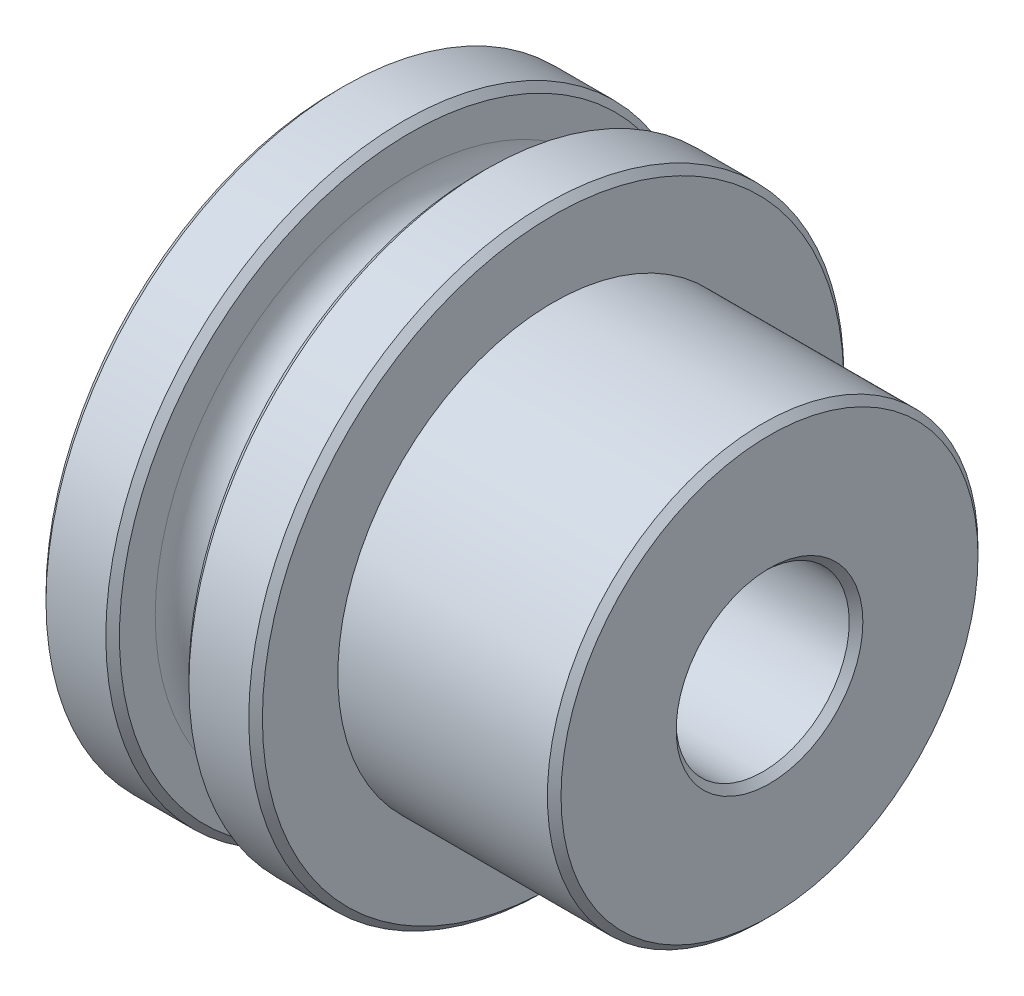
ISO-10303-21;
HEADER;
FILE_DESCRIPTION(('STEP AP214'),'2;1');
FILE_NAME('part.step','',(''),(''),'','','');
FILE_SCHEMA(('AUTOMOTIVE_DESIGN { 1 0 10303 214 1 1 1 1 }'));
ENDSEC;
DATA;
#1=APPLICATION_CONTEXT('core data for automotive mechanical design processes');
#2=APPLICATION_PROTOCOL_DEFINITION('international standard','automotive_design',2000,#1);
#3=PRODUCT_CONTEXT('',#1,'mechanical');
#4=PRODUCT('Part','Part','',(#3));
#5=PRODUCT_RELATED_PRODUCT_CATEGORY('part','',(#4));
#6=PRODUCT_DEFINITION_FORMATION('','',#4);
#7=PRODUCT_DEFINITION_CONTEXT('part definition',#1,'design');
#8=PRODUCT_DEFINITION('design','',#6,#7);
#9=PRODUCT_DEFINITION_SHAPE('','',#8);
#10=(LENGTH_UNIT() NAMED_UNIT(*) SI_UNIT(.MILLI.,.METRE.));
#11=(NAMED_UNIT(*) PLANE_ANGLE_UNIT() SI_UNIT($,.RADIAN.));
#12=(NAMED_UNIT(*) SI_UNIT($,.STERADIAN.) SOLID_ANGLE_UNIT());
#13=UNCERTAINTY_MEASURE_WITH_UNIT(LENGTH_MEASURE(1.E-05),#10,'distance_accuracy_value','');
#14=(GEOMETRIC_REPRESENTATION_CONTEXT(3) GLOBAL_UNCERTAINTY_ASSIGNED_CONTEXT((#13)) GLOBAL_UNIT_ASSIGNED_CONTEXT((#10,
#11,#12)) REPRESENTATION_CONTEXT('',''));
#15=CARTESIAN_POINT('',(0.,0.,0.));
#16=DIRECTION('',(0.,0.,1.));
#17=DIRECTION('',(1.,0.,0.));
#18=AXIS2_PLACEMENT_3D('',#15,#16,#17);
#19=CARTESIAN_POINT('',(-12.7,0.,0.));
#20=DIRECTION('',(1.,0.,0.));
#21=DIRECTION('',(0.,0.,-1.));
#22=AXIS2_PLACEMENT_3D('',#19,#20,#21);
#23=CYLINDRICAL_SURFACE('',#22,17.4625);
#24=CARTESIAN_POINT('',(-8.78999998400001,0.,0.));
#25=DIRECTION('',(1.,0.,0.));
#26=DIRECTION('',(0.,0.,-1.));
#27=AXIS2_PLACEMENT_3D('',#24,#25,#26);
#28=CIRCLE('',#27,17.4625);
#29=CARTESIAN_POINT('',(-8.78999998400001,0.,-17.4625));
#30=VERTEX_POINT('',#29);
#31=EDGE_CURVE('E75',#30,#30,#28,.F.);
#32=ORIENTED_EDGE('',*,*,#31,.T.);
#33=EDGE_LOOP('',(#32));
#34=FACE_BOUND('',#33,.T.);
#35=CARTESIAN_POINT('',(-12.3,0.,0.));
#36=DIRECTION('',(-1.,0.,0.));
#37=DIRECTION('',(0.,0.,1.));
#38=AXIS2_PLACEMENT_3D('',#35,#36,#37);
#39=CIRCLE('',#38,17.4625);
#40=CARTESIAN_POINT('',(-12.3,0.,17.4625));
#41=VERTEX_POINT('',#40);
#42=EDGE_CURVE('E78',#41,#41,#39,.F.);
#43=ORIENTED_EDGE('',*,*,#42,.T.);
#44=EDGE_LOOP('',(#43));
#45=FACE_BOUND('',#44,.T.);
#46=ADVANCED_FACE('F39',(#34,#45),#23,.T.);
#47=CARTESIAN_POINT('',(12.7,0.,0.));
#48=DIRECTION('',(-1.,0.,0.));
#49=DIRECTION('',(0.,0.,1.));
#50=AXIS2_PLACEMENT_3D('',#47,#48,#49);
#51=CYLINDRICAL_SURFACE('',#50,12.6365);
#52=CARTESIAN_POINT('',(12.3,0.,0.));
#53=DIRECTION('',(1.,0.,0.));
#54=DIRECTION('',(0.,0.,-1.));
#55=AXIS2_PLACEMENT_3D('',#52,#53,#54);
#56=CIRCLE('',#55,12.6365);
#57=CARTESIAN_POINT('',(12.3,0.,-12.6365));
#58=VERTEX_POINT('',#57);
#59=EDGE_CURVE('E47',#58,#58,#56,.F.);
#60=ORIENTED_EDGE('',*,*,#59,.T.);
#61=EDGE_LOOP('',(#60));
#62=FACE_BOUND('',#61,.T.);
#63=CARTESIAN_POINT('',(0.,0.,0.));
#64=DIRECTION('',(1.,0.,0.));
#65=DIRECTION('',(0.,0.,-1.));
#66=AXIS2_PLACEMENT_3D('',#63,#64,#65);
#67=CIRCLE('',#66,12.6365);
#68=CARTESIAN_POINT('',(0.,0.,-12.6365));
#69=VERTEX_POINT('',#68);
#70=EDGE_CURVE('E90',#69,#69,#67,.T.);
#71=ORIENTED_EDGE('',*,*,#70,.T.);
#72=EDGE_LOOP('',(#71));
#73=FACE_BOUND('',#72,.T.);
#74=ADVANCED_FACE('F130',(#62,#73),#51,.T.);
#75=CARTESIAN_POINT('',(12.7,0.,0.));
#76=DIRECTION('',(1.,0.,0.));
#77=DIRECTION('',(0.,0.,-1.));
#78=AXIS2_PLACEMENT_3D('',#75,#76,#77);
#79=PLANE('',#78);
#80=CARTESIAN_POINT('',(12.7,0.,0.));
#81=DIRECTION('',(1.,0.,0.));
#82=DIRECTION('',(0.,0.,-1.));
#83=AXIS2_PLACEMENT_3D('',#80,#81,#82);
#84=CIRCLE('',#83,12.2365);
#85=CARTESIAN_POINT('',(12.7,0.,-12.2365));
#86=VERTEX_POINT('',#85);
#87=EDGE_CURVE('E51',#86,#86,#84,.T.);
#88=ORIENTED_EDGE('',*,*,#87,.T.);
#89=EDGE_LOOP('',(#88));
#90=FACE_BOUND('',#89,.T.);
#91=CARTESIAN_POINT('',(12.7,0.,0.));
#92=DIRECTION('',(1.,0.,0.));
#93=DIRECTION('',(0.,0.,-1.));
#94=AXIS2_PLACEMENT_3D('',#91,#92,#93);
#95=CIRCLE('',#94,5.48000000000001);
#96=CARTESIAN_POINT('',(12.7,0.,-5.48000000000001));
#97=VERTEX_POINT('',#96);
#98=EDGE_CURVE('E55',#97,#97,#95,.F.);
#99=ORIENTED_EDGE('',*,*,#98,.T.);
#100=EDGE_LOOP('',(#99));
#101=FACE_BOUND('',#100,.T.);
#102=ADVANCED_FACE('F137',(#90,#101),#79,.T.);
#103=CARTESIAN_POINT('',(-0.399999999999998,0.,0.));
#104=DIRECTION('',(-1.,0.,0.));
#105=DIRECTION('',(0.,0.,1.));
#106=AXIS2_PLACEMENT_3D('',#103,#104,#105);
#107=CIRCLE('',#106,17.4625);
#108=CARTESIAN_POINT('',(-0.399999999999998,0.,17.4625));
#109=VERTEX_POINT('',#108);
#110=EDGE_CURVE('E66',#109,#109,#107,.T.);
#111=ORIENTED_EDGE('',*,*,#110,.T.);
#112=EDGE_LOOP('',(#111));
#113=FACE_BOUND('',#112,.T.);
#114=CARTESIAN_POINT('',(-3.91000001600001,0.,0.));
#115=DIRECTION('',(1.,0.,0.));
#116=DIRECTION('',(0.,0.,-1.));
#117=AXIS2_PLACEMENT_3D('',#114,#115,#116);
#118=CIRCLE('',#117,17.4625);
#119=CARTESIAN_POINT('',(-3.91000001600001,0.,-17.4625));
#120=VERTEX_POINT('',#119);
#121=EDGE_CURVE('E69',#120,#120,#118,.T.);
#122=ORIENTED_EDGE('',*,*,#121,.T.);
#123=EDGE_LOOP('',(#122));
#124=FACE_BOUND('',#123,.T.);
#125=ADVANCED_FACE('F133',(#113,#124),#23,.T.);
#126=CARTESIAN_POINT('',(-12.7,0.,0.));
#127=DIRECTION('',(-1.,0.,0.));
#128=DIRECTION('',(0.,0.,1.));
#129=AXIS2_PLACEMENT_3D('',#126,#127,#128);
#130=PLANE('',#129);
#131=CARTESIAN_POINT('',(-12.7,0.,0.));
#132=DIRECTION('',(-1.,0.,0.));
#133=DIRECTION('',(0.,0.,1.));
#134=AXIS2_PLACEMENT_3D('',#131,#132,#133);
#135=CIRCLE('',#134,11.5125);
#136=CARTESIAN_POINT('',(-12.7,0.,11.5125));
#137=VERTEX_POINT('',#136);
#138=EDGE_CURVE('E81',#137,#137,#135,.F.);
#139=ORIENTED_EDGE('',*,*,#138,.T.);
#140=EDGE_LOOP('',(#139));
#141=FACE_BOUND('',#140,.T.);
#142=CARTESIAN_POINT('',(-12.7,0.,0.));
#143=DIRECTION('',(-1.,0.,0.));
#144=DIRECTION('',(0.,0.,1.));
#145=AXIS2_PLACEMENT_3D('',#142,#143,#144);
#146=CIRCLE('',#145,17.0625);
#147=CARTESIAN_POINT('',(-12.7,0.,17.0625));
#148=VERTEX_POINT('',#147);
#149=EDGE_CURVE('E84',#148,#148,#146,.T.);
#150=ORIENTED_EDGE('',*,*,#149,.T.);
#151=EDGE_LOOP('',(#150));
#152=FACE_BOUND('',#151,.T.);
#153=ADVANCED_FACE('F143',(#141,#152),#130,.T.);
#154=CARTESIAN_POINT('',(0.,0.,0.));
#155=DIRECTION('',(-1.,0.,0.));
#156=DIRECTION('',(0.,0.,1.));
#157=AXIS2_PLACEMENT_3D('',#154,#155,#156);
#158=PLANE('',#157);
#159=CARTESIAN_POINT('',(0.,0.,0.));
#160=DIRECTION('',(-1.,0.,0.));
#161=DIRECTION('',(0.,0.,1.));
#162=AXIS2_PLACEMENT_3D('',#159,#160,#161);
#163=CIRCLE('',#162,17.0625);
#164=CARTESIAN_POINT('',(0.,0.,17.0625));
#165=VERTEX_POINT('',#164);
#166=EDGE_CURVE('E63',#165,#165,#163,.F.);
#167=ORIENTED_EDGE('',*,*,#166,.T.);
#168=EDGE_LOOP('',(#167));
#169=FACE_BOUND('',#168,.T.);
#170=ORIENTED_EDGE('',*,*,#70,.F.);
#171=EDGE_LOOP('',(#170));
#172=FACE_BOUND('',#171,.T.);
#173=ADVANCED_FACE('F149',(#169,#172),#158,.F.);
#174=CARTESIAN_POINT('',(-5.588,0.,0.));
#175=DIRECTION('',(-1.,0.,0.));
#176=DIRECTION('',(0.,0.,1.));
#177=AXIS2_PLACEMENT_3D('',#174,#175,#176);
#178=CYLINDRICAL_SURFACE('',#177,11.1125);
#179=CARTESIAN_POINT('',(-12.3,0.,0.));
#180=DIRECTION('',(-1.,0.,0.));
#181=DIRECTION('',(0.,0.,1.));
#182=AXIS2_PLACEMENT_3D('',#179,#180,#181);
#183=CIRCLE('',#182,11.1125);
#184=CARTESIAN_POINT('',(-12.3,0.,11.1125));
#185=VERTEX_POINT('',#184);
#186=EDGE_CURVE('E87',#185,#185,#183,.T.);
#187=ORIENTED_EDGE('',*,*,#186,.T.);
#188=EDGE_LOOP('',(#187));
#189=FACE_BOUND('',#188,.T.);
#190=CARTESIAN_POINT('',(-5.588,0.,0.));
#191=DIRECTION('',(-1.,0.,0.));
#192=DIRECTION('',(0.,0.,1.));
#193=AXIS2_PLACEMENT_3D('',#190,#191,#192);
#194=CIRCLE('',#193,11.1125);
#195=CARTESIAN_POINT('',(-5.588,0.,11.1125));
#196=VERTEX_POINT('',#195);
#197=EDGE_CURVE('E93',#196,#196,#194,.T.);
#198=ORIENTED_EDGE('',*,*,#197,.F.);
#199=EDGE_LOOP('',(#198));
#200=FACE_BOUND('',#199,.T.);
#201=ADVANCED_FACE('F225',(#189,#200),#178,.F.);
#202=CARTESIAN_POINT('',(-5.588,0.,0.));
#203=DIRECTION('',(-1.,0.,0.));
#204=DIRECTION('',(0.,0.,1.));
#205=AXIS2_PLACEMENT_3D('',#202,#203,#204);
#206=PLANE('',#205);
#207=CARTESIAN_POINT('',(-5.588,0.,0.));
#208=DIRECTION('',(-1.,0.,0.));
#209=DIRECTION('',(0.,0.,1.));
#210=AXIS2_PLACEMENT_3D('',#207,#208,#209);
#211=CIRCLE('',#210,7.27458794);
#212=CARTESIAN_POINT('',(-5.588,0.,7.27458794));
#213=VERTEX_POINT('',#212);
#214=EDGE_CURVE('E97',#213,#213,#211,.T.);
#215=ORIENTED_EDGE('',*,*,#214,.F.);
#216=EDGE_LOOP('',(#215));
#217=FACE_BOUND('',#216,.T.);
#218=ORIENTED_EDGE('',*,*,#197,.T.);
#219=EDGE_LOOP('',(#218));
#220=FACE_BOUND('',#219,.T.);
#221=ADVANCED_FACE('F221',(#217,#220),#206,.T.);
#222=CARTESIAN_POINT('',(-5.388,0.,0.));
#223=DIRECTION('',(-1.,0.,0.));
#224=DIRECTION('',(0.,0.,1.));
#225=AXIS2_PLACEMENT_3D('',#222,#223,#224);
#226=CYLINDRICAL_SURFACE('',#225,7.27458794);
#227=CARTESIAN_POINT('',(-5.388,0.,0.));
#228=DIRECTION('',(-1.,0.,0.));
#229=DIRECTION('',(0.,0.,1.));
#230=AXIS2_PLACEMENT_3D('',#227,#228,#229);
#231=CIRCLE('',#230,7.27458794);
#232=CARTESIAN_POINT('',(-5.388,0.,7.27458794));
#233=VERTEX_POINT('',#232);
#234=EDGE_CURVE('E96',#233,#233,#231,.T.);
#235=ORIENTED_EDGE('',*,*,#234,.F.);
#236=EDGE_LOOP('',(#235));
#237=FACE_BOUND('',#236,.T.);
#238=ORIENTED_EDGE('',*,*,#214,.T.);
#239=EDGE_LOOP('',(#238));
#240=FACE_BOUND('',#239,.T.);
#241=ADVANCED_FACE('F217',(#237,#240),#226,.F.);
#242=CARTESIAN_POINT('',(-5.388,0.,0.));
#243=DIRECTION('',(-1.,0.,0.));
#244=DIRECTION('',(0.,0.,1.));
#245=AXIS2_PLACEMENT_3D('',#242,#243,#244);
#246=PLANE('',#245);
#247=CARTESIAN_POINT('',(-5.388,0.,0.));
#248=DIRECTION('',(-1.,0.,0.));
#249=DIRECTION('',(0.,0.,1.));
#250=AXIS2_PLACEMENT_3D('',#247,#248,#249);
#251=CIRCLE('',#250,5.08);
#252=CARTESIAN_POINT('',(-5.388,0.,5.08));
#253=VERTEX_POINT('',#252);
#254=EDGE_CURVE('E100',#253,#253,#251,.T.);
#255=ORIENTED_EDGE('',*,*,#254,.F.);
#256=EDGE_LOOP('',(#255));
#257=FACE_BOUND('',#256,.T.);
#258=ORIENTED_EDGE('',*,*,#234,.T.);
#259=EDGE_LOOP('',(#258));
#260=FACE_BOUND('',#259,.T.);
#261=ADVANCED_FACE('F212',(#257,#260),#246,.T.);
#262=CARTESIAN_POINT('',(12.7,0.,0.));
#263=DIRECTION('',(-1.,0.,0.));
#264=DIRECTION('',(0.,0.,1.));
#265=AXIS2_PLACEMENT_3D('',#262,#263,#264);
#266=CYLINDRICAL_SURFACE('',#265,5.08);
#267=CARTESIAN_POINT('',(12.3,0.,0.));
#268=DIRECTION('',(1.,0.,0.));
#269=DIRECTION('',(0.,0.,-1.));
#270=AXIS2_PLACEMENT_3D('',#267,#268,#269);
#271=CIRCLE('',#270,5.08);
#272=CARTESIAN_POINT('',(12.3,0.,-5.08));
#273=VERTEX_POINT('',#272);
#274=EDGE_CURVE('E10',#273,#273,#271,.T.);
#275=ORIENTED_EDGE('',*,*,#274,.T.);
#276=EDGE_LOOP('',(#275));
#277=FACE_BOUND('',#276,.T.);
#278=ORIENTED_EDGE('',*,*,#254,.T.);
#279=EDGE_LOOP('',(#278));
#280=FACE_BOUND('',#279,.T.);
#281=ADVANCED_FACE('F206',(#277,#280),#266,.F.);
#282=CARTESIAN_POINT('',(-8.389999984,0.,0.));
#283=DIRECTION('',(1.,0.,0.));
#284=DIRECTION('',(0.,0.,-1.));
#285=AXIS2_PLACEMENT_3D('',#282,#283,#284);
#286=PLANE('',#285);
#287=CARTESIAN_POINT('',(-8.389999984,0.,0.));
#288=DIRECTION('',(1.,0.,0.));
#289=DIRECTION('',(0.,0.,-1.));
#290=AXIS2_PLACEMENT_3D('',#287,#288,#289);
#291=CIRCLE('',#290,17.0625);
#292=CARTESIAN_POINT('',(-8.389999984,0.,-17.0625));
#293=VERTEX_POINT('',#292);
#294=EDGE_CURVE('E72',#293,#293,#291,.T.);
#295=ORIENTED_EDGE('',*,*,#294,.T.);
#296=EDGE_LOOP('',(#295));
#297=FACE_BOUND('',#296,.T.);
#298=CARTESIAN_POINT('',(-8.389999984,0.,0.));
#299=DIRECTION('',(-1.,0.,0.));
#300=DIRECTION('',(0.,0.,1.));
#301=AXIS2_PLACEMENT_3D('',#298,#299,#300);
#302=CIRCLE('',#301,14.96249992);
#303=CARTESIAN_POINT('',(-8.389999984,0.,14.96249992));
#304=VERTEX_POINT('',#303);
#305=EDGE_CURVE('E105',#304,#304,#302,.T.);
#306=ORIENTED_EDGE('',*,*,#305,.T.);
#307=EDGE_LOOP('',(#306));
#308=FACE_BOUND('',#307,.T.);
#309=ADVANCED_FACE('F127',(#297,#308),#286,.T.);
#310=CARTESIAN_POINT('',(-6.35,0.,0.));
#311=DIRECTION('',(-1.,0.,0.));
#312=DIRECTION('',(0.,0.,1.));
#313=AXIS2_PLACEMENT_3D('',#310,#311,#312);
#314=TOROIDAL_SURFACE('',#313,14.96249992,2.039999984);
#315=CARTESIAN_POINT('',(-4.310000016,0.,0.));
#316=DIRECTION('',(-1.,0.,0.));
#317=DIRECTION('',(0.,0.,1.));
#318=AXIS2_PLACEMENT_3D('',#315,#316,#317);
#319=CIRCLE('',#318,14.96249992);
#320=CARTESIAN_POINT('',(-4.310000016,0.,14.96249992));
#321=VERTEX_POINT('',#320);
#322=EDGE_CURVE('E108',#321,#321,#319,.T.);
#323=ORIENTED_EDGE('',*,*,#322,.T.);
#324=EDGE_LOOP('',(#323));
#325=FACE_BOUND('',#324,.T.);
#326=ORIENTED_EDGE('',*,*,#305,.F.);
#327=EDGE_LOOP('',(#326));
#328=FACE_BOUND('',#327,.T.);
#329=ADVANCED_FACE('F112',(#325,#328),#314,.F.);
#330=CARTESIAN_POINT('',(-4.310000016,0.,0.));
#331=DIRECTION('',(1.,0.,0.));
#332=DIRECTION('',(0.,0.,-1.));
#333=AXIS2_PLACEMENT_3D('',#330,#331,#332);
#334=PLANE('',#333);
#335=CARTESIAN_POINT('',(-4.310000016,0.,0.));
#336=DIRECTION('',(1.,0.,0.));
#337=DIRECTION('',(0.,0.,-1.));
#338=AXIS2_PLACEMENT_3D('',#335,#336,#337);
#339=CIRCLE('',#338,17.0625);
#340=CARTESIAN_POINT('',(-4.310000016,0.,-17.0625));
#341=VERTEX_POINT('',#340);
#342=EDGE_CURVE('E60',#341,#341,#339,.F.);
#343=ORIENTED_EDGE('',*,*,#342,.T.);
#344=EDGE_LOOP('',(#343));
#345=FACE_BOUND('',#344,.T.);
#346=ORIENTED_EDGE('',*,*,#322,.F.);
#347=EDGE_LOOP('',(#346));
#348=FACE_BOUND('',#347,.T.);
#349=ADVANCED_FACE('F115',(#345,#348),#334,.F.);
#350=CARTESIAN_POINT('',(-12.3,0.,0.));
#351=DIRECTION('',(-1.,0.,0.));
#352=DIRECTION('',(0.,0.,1.));
#353=AXIS2_PLACEMENT_3D('',#350,#351,#352);
#354=CONICAL_SURFACE('',#353,11.1125,0.785398163397453);
#355=CARTESIAN_POINT('',(-12.7,0.,11.5125));
#356=CARTESIAN_POINT('',(-12.6958333333333,0.,11.5083333333333));
#357=CARTESIAN_POINT('',(-12.6916666666667,0.,11.5041666666667));
#358=CARTESIAN_POINT('',(-12.6833333333333,0.,11.4958333333333));
#359=CARTESIAN_POINT('',(-12.6791666666667,0.,11.4916666666667));
#360=CARTESIAN_POINT('',(-12.6708333333333,0.,11.4833333333333));
#361=CARTESIAN_POINT('',(-12.6666666666667,0.,11.4791666666667));
#362=CARTESIAN_POINT('',(-12.6583333333333,0.,11.4708333333333));
#363=CARTESIAN_POINT('',(-12.6541666666667,0.,11.4666666666667));
#364=CARTESIAN_POINT('',(-12.6458333333333,0.,11.4583333333333));
#365=CARTESIAN_POINT('',(-12.6416666666667,0.,11.4541666666667));
#366=CARTESIAN_POINT('',(-12.6333333333333,0.,11.4458333333333));
#367=CARTESIAN_POINT('',(-12.6291666666667,0.,11.4416666666667));
#368=CARTESIAN_POINT('',(-12.6208333333333,0.,11.4333333333333));
#369=CARTESIAN_POINT('',(-12.6166666666667,0.,11.4291666666667));
#370=CARTESIAN_POINT('',(-12.6083333333333,0.,11.4208333333333));
#371=CARTESIAN_POINT('',(-12.6041666666667,0.,11.4166666666667));
#372=CARTESIAN_POINT('',(-12.5958333333333,0.,11.4083333333333));
#373=CARTESIAN_POINT('',(-12.5916666666667,0.,11.4041666666667));
#374=CARTESIAN_POINT('',(-12.5833333333333,0.,11.3958333333333));
#375=CARTESIAN_POINT('',(-12.5791666666667,0.,11.3916666666667));
#376=CARTESIAN_POINT('',(-12.5708333333333,0.,11.3833333333333));
#377=CARTESIAN_POINT('',(-12.5666666666667,0.,11.3791666666667));
#378=CARTESIAN_POINT('',(-12.5583333333333,0.,11.3708333333333));
#379=CARTESIAN_POINT('',(-12.5541666666667,0.,11.3666666666667));
#380=CARTESIAN_POINT('',(-12.5458333333333,0.,11.3583333333333));
#381=CARTESIAN_POINT('',(-12.5416666666667,0.,11.3541666666667));
#382=CARTESIAN_POINT('',(-12.5333333333333,0.,11.3458333333333));
#383=CARTESIAN_POINT('',(-12.5291666666667,0.,11.3416666666667));
#384=CARTESIAN_POINT('',(-12.5208333333333,0.,11.3333333333333));
#385=CARTESIAN_POINT('',(-12.5166666666667,0.,11.3291666666667));
#386=CARTESIAN_POINT('',(-12.5083333333333,0.,11.3208333333333));
#387=CARTESIAN_POINT('',(-12.5041666666667,0.,11.3166666666667));
#388=CARTESIAN_POINT('',(-12.4958333333333,0.,11.3083333333333));
#389=CARTESIAN_POINT('',(-12.4916666666667,0.,11.3041666666667));
#390=CARTESIAN_POINT('',(-12.4833333333333,0.,11.2958333333333));
#391=CARTESIAN_POINT('',(-12.4791666666667,0.,11.2916666666667));
#392=CARTESIAN_POINT('',(-12.4708333333333,0.,11.2833333333333));
#393=CARTESIAN_POINT('',(-12.4666666666667,0.,11.2791666666667));
#394=CARTESIAN_POINT('',(-12.4583333333333,0.,11.2708333333333));
#395=CARTESIAN_POINT('',(-12.4541666666667,0.,11.2666666666667));
#396=CARTESIAN_POINT('',(-12.4458333333333,0.,11.2583333333333));
#397=CARTESIAN_POINT('',(-12.4416666666667,0.,11.2541666666667));
#398=CARTESIAN_POINT('',(-12.4333333333333,0.,11.2458333333333));
#399=CARTESIAN_POINT('',(-12.4291666666667,0.,11.2416666666667));
#400=CARTESIAN_POINT('',(-12.4208333333333,0.,11.2333333333333));
#401=CARTESIAN_POINT('',(-12.4166666666667,0.,11.2291666666667));
#402=CARTESIAN_POINT('',(-12.4083333333333,0.,11.2208333333333));
#403=CARTESIAN_POINT('',(-12.4041666666667,0.,11.2166666666667));
#404=CARTESIAN_POINT('',(-12.3958333333333,0.,11.2083333333333));
#405=CARTESIAN_POINT('',(-12.3916666666667,0.,11.2041666666667));
#406=CARTESIAN_POINT('',(-12.3833333333333,0.,11.1958333333333));
#407=CARTESIAN_POINT('',(-12.3791666666667,0.,11.1916666666667));
#408=CARTESIAN_POINT('',(-12.3708333333333,0.,11.1833333333333));
#409=CARTESIAN_POINT('',(-12.3666666666667,0.,11.1791666666667));
#410=CARTESIAN_POINT('',(-12.3583333333333,0.,11.1708333333333));
#411=CARTESIAN_POINT('',(-12.3541666666667,0.,11.1666666666667));
#412=CARTESIAN_POINT('',(-12.3458333333333,0.,11.1583333333333));
#413=CARTESIAN_POINT('',(-12.3416666666667,0.,11.1541666666667));
#414=CARTESIAN_POINT('',(-12.3333333333333,0.,11.1458333333333));
#415=CARTESIAN_POINT('',(-12.3291666666667,0.,11.1416666666667));
#416=CARTESIAN_POINT('',(-12.3208333333333,0.,11.1333333333333));
#417=CARTESIAN_POINT('',(-12.3166666666667,0.,11.1291666666667));
#418=CARTESIAN_POINT('',(-12.3083333333333,0.,11.1208333333333));
#419=CARTESIAN_POINT('',(-12.3041666666667,0.,11.1166666666667));
#420=CARTESIAN_POINT('',(-12.3,0.,11.1125));
#421=B_SPLINE_CURVE_WITH_KNOTS('',3,(#355,#356,#357,#358,#359,#360,#361,#362,#363,#364,#365,
#366,#367,#368,#369,#370,#371,#372,#373,#374,#375,#376,#377,#378,#379,#380,#381,#382,#383,#384,
#385,#386,#387,#388,#389,#390,#391,#392,#393,#394,#395,#396,#397,#398,#399,#400,#401,#402,#403,
#404,#405,#406,#407,#408,#409,#410,#411,#412,#413,#414,#415,#416,#417,#418,#419,#420),
.UNSPECIFIED.,.F.,.F.,(4,2,2,2,2,2,2,2,2,2,2,2,2,2,2,2,2,2,2,2,2,2,2,2,2,2,2,2,2,2,2,2,4),(0.,
0.017677669529663,0.0353553390593272,0.0530330085889914,0.0707106781186556,0.0883883476483185,
0.106066017177983,0.123743686707646,0.14142135623731,0.159099025766974,0.176776695296637,
0.194454364826301,0.212132034355965,0.229809703885628,0.247487373415291,0.265165042944956,
0.28284271247462,0.300520382004284,0.318198051533948,0.335875721063611,0.353553390593274,
0.371231060122938,0.388908729652602,0.406586399182265,0.42426406871193,0.441941738241594,
0.459619407771257,0.477297077300921,0.494974746830584,0.512652416360248,0.530330085889912,
0.548007755419576,0.565685424949239),.UNSPECIFIED.);
#422=EDGE_CURVE('BSEAM117',#137,#185,#421,.T.);
#423=ORIENTED_EDGE('',*,*,#138,.F.);
#424=ORIENTED_EDGE('',*,*,#186,.F.);
#425=ORIENTED_EDGE('',*,*,#422,.T.);
#426=ORIENTED_EDGE('',*,*,#422,.F.);
#427=EDGE_LOOP('',(#423,#425,#424,#426));
#428=FACE_BOUND('',#427,.T.);
#429=ADVANCED_FACE('F117',(#428),#354,.F.);
#430=CARTESIAN_POINT('',(-8.78999998400001,0.,0.));
#431=DIRECTION('',(-1.,0.,0.));
#432=DIRECTION('',(0.,0.,1.));
#433=AXIS2_PLACEMENT_3D('',#430,#431,#432);
#434=CONICAL_SURFACE('',#433,17.4625,0.785398163397453);
#435=ORIENTED_EDGE('',*,*,#294,.F.);
#436=EDGE_LOOP('',(#435));
#437=FACE_BOUND('',#436,.T.);
#438=ORIENTED_EDGE('',*,*,#31,.F.);
#439=EDGE_LOOP('',(#438));
#440=FACE_BOUND('',#439,.T.);
#441=ADVANCED_FACE('F124',(#437,#440),#434,.T.);
#442=CARTESIAN_POINT('',(-12.7,0.,0.));
#443=DIRECTION('',(1.,0.,0.));
#444=DIRECTION('',(0.,0.,-1.));
#445=AXIS2_PLACEMENT_3D('',#442,#443,#444);
#446=CONICAL_SURFACE('',#445,17.0625,0.785398163397457);
#447=ORIENTED_EDGE('',*,*,#42,.F.);
#448=EDGE_LOOP('',(#447));
#449=FACE_BOUND('',#448,.T.);
#450=ORIENTED_EDGE('',*,*,#149,.F.);
#451=EDGE_LOOP('',(#450));
#452=FACE_BOUND('',#451,.T.);
#453=ADVANCED_FACE('F169',(#449,#452),#446,.T.);
#454=CARTESIAN_POINT('',(-0.399999999999998,0.,0.));
#455=DIRECTION('',(-1.,0.,0.));
#456=DIRECTION('',(0.,0.,1.));
#457=AXIS2_PLACEMENT_3D('',#454,#455,#456);
#458=CONICAL_SURFACE('',#457,17.4625,0.785398163397448);
#459=ORIENTED_EDGE('',*,*,#166,.F.);
#460=EDGE_LOOP('',(#459));
#461=FACE_BOUND('',#460,.T.);
#462=ORIENTED_EDGE('',*,*,#110,.F.);
#463=EDGE_LOOP('',(#462));
#464=FACE_BOUND('',#463,.T.);
#465=ADVANCED_FACE('F161',(#461,#464),#458,.T.);
#466=CARTESIAN_POINT('',(-4.310000016,0.,0.));
#467=DIRECTION('',(1.,0.,0.));
#468=DIRECTION('',(0.,0.,-1.));
#469=AXIS2_PLACEMENT_3D('',#466,#467,#468);
#470=CONICAL_SURFACE('',#469,17.0625,0.785398163397457);
#471=ORIENTED_EDGE('',*,*,#121,.F.);
#472=EDGE_LOOP('',(#471));
#473=FACE_BOUND('',#472,.T.);
#474=ORIENTED_EDGE('',*,*,#342,.F.);
#475=EDGE_LOOP('',(#474));
#476=FACE_BOUND('',#475,.T.);
#477=ADVANCED_FACE('F157',(#473,#476),#470,.T.);
#478=CARTESIAN_POINT('',(12.7,0.,0.));
#479=DIRECTION('',(-1.,0.,0.));
#480=DIRECTION('',(0.,0.,1.));
#481=AXIS2_PLACEMENT_3D('',#478,#479,#480);
#482=CONICAL_SURFACE('',#481,12.2365,0.78539816339745);
#483=ORIENTED_EDGE('',*,*,#59,.F.);
#484=EDGE_LOOP('',(#483));
#485=FACE_BOUND('',#484,.T.);
#486=ORIENTED_EDGE('',*,*,#87,.F.);
#487=EDGE_LOOP('',(#486));
#488=FACE_BOUND('',#487,.T.);
#489=ADVANCED_FACE('F160',(#485,#488),#482,.T.);
#490=CARTESIAN_POINT('',(12.7,0.,0.));
#491=DIRECTION('',(1.,0.,0.));
#492=DIRECTION('',(0.,0.,-1.));
#493=AXIS2_PLACEMENT_3D('',#490,#491,#492);
#494=CONICAL_SURFACE('',#493,5.48000000000001,0.785398163397456);
#495=ORIENTED_EDGE('',*,*,#274,.F.);
#496=EDGE_LOOP('',(#495));
#497=FACE_BOUND('',#496,.T.);
#498=ORIENTED_EDGE('',*,*,#98,.F.);
#499=EDGE_LOOP('',(#498));
#500=FACE_BOUND('',#499,.T.);
#501=ADVANCED_FACE('F42',(#497,#500),#494,.F.);
#502=CLOSED_SHELL('',(#46,#74,#102,#125,#153,#173,#201,#221,#241,#261,#281,#309,#329,#349,#429,
#441,#453,#465,#477,#489,#501));
#503=MANIFOLD_SOLID_BREP('B2',#502);
#504=ADVANCED_BREP_SHAPE_REPRESENTATION('',(#18,#503),#14);
#505=SHAPE_DEFINITION_REPRESENTATION(#9,#504);
ENDSEC;
END-ISO-10303-21;
